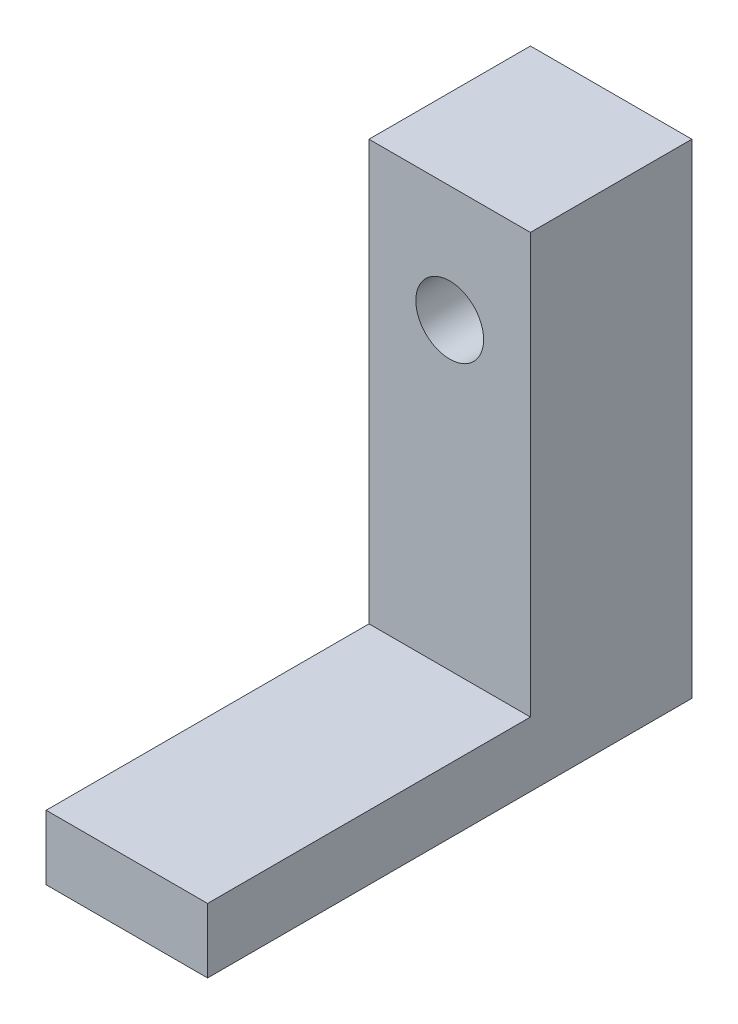
ISO-10303-21;
HEADER;
FILE_DESCRIPTION(('STEP AP214'),'2;1');
FILE_NAME('part.step','',(''),(''),'','','');
FILE_SCHEMA(('AUTOMOTIVE_DESIGN { 1 0 10303 214 1 1 1 1 }'));
ENDSEC;
DATA;
#1=APPLICATION_CONTEXT('core data for automotive mechanical design processes');
#2=APPLICATION_PROTOCOL_DEFINITION('international standard','automotive_design',2000,#1);
#3=PRODUCT_CONTEXT('',#1,'mechanical');
#4=PRODUCT('Part','Part','',(#3));
#5=PRODUCT_RELATED_PRODUCT_CATEGORY('part','',(#4));
#6=PRODUCT_DEFINITION_FORMATION('','',#4);
#7=PRODUCT_DEFINITION_CONTEXT('part definition',#1,'design');
#8=PRODUCT_DEFINITION('design','',#6,#7);
#9=PRODUCT_DEFINITION_SHAPE('','',#8);
#10=(LENGTH_UNIT() NAMED_UNIT(*) SI_UNIT(.MILLI.,.METRE.));
#11=(NAMED_UNIT(*) PLANE_ANGLE_UNIT() SI_UNIT($,.RADIAN.));
#12=(NAMED_UNIT(*) SI_UNIT($,.STERADIAN.) SOLID_ANGLE_UNIT());
#13=UNCERTAINTY_MEASURE_WITH_UNIT(LENGTH_MEASURE(1.E-05),#10,'distance_accuracy_value','');
#14=(GEOMETRIC_REPRESENTATION_CONTEXT(3) GLOBAL_UNCERTAINTY_ASSIGNED_CONTEXT((#13)) GLOBAL_UNIT_ASSIGNED_CONTEXT((#10,
#11,#12)) REPRESENTATION_CONTEXT('',''));
#15=CARTESIAN_POINT('',(0.,0.,0.));
#16=DIRECTION('',(0.,0.,1.));
#17=DIRECTION('',(1.,0.,0.));
#18=AXIS2_PLACEMENT_3D('',#15,#16,#17);
#19=CARTESIAN_POINT('',(0.,0.,5.));
#20=DIRECTION('',(0.,0.,-1.));
#21=DIRECTION('',(-1.,0.,0.));
#22=AXIS2_PLACEMENT_3D('',#19,#20,#21);
#23=PLANE('',#22);
#24=CARTESIAN_POINT('',(2.5,11.4,5.));
#25=DIRECTION('',(0.,0.,1.));
#26=DIRECTION('',(1.,0.,0.));
#27=AXIS2_PLACEMENT_3D('',#24,#25,#26);
#28=CIRCLE('',#27,1.05);
#29=CARTESIAN_POINT('',(3.55,11.4,5.));
#30=VERTEX_POINT('',#29);
#31=EDGE_CURVE('E235',#30,#30,#28,.T.);
#32=ORIENTED_EDGE('',*,*,#31,.F.);
#33=EDGE_LOOP('',(#32));
#34=FACE_BOUND('',#33,.T.);
#35=DIRECTION('',(-1.,0.,0.));
#36=VECTOR('',#35,1.);
#37=CARTESIAN_POINT('',(0.,2.,5.));
#38=LINE('',#37,#36);
#39=CARTESIAN_POINT('',(5.,2.,5.));
#40=VERTEX_POINT('',#39);
#41=CARTESIAN_POINT('',(0.,2.,5.));
#42=VERTEX_POINT('',#41);
#43=EDGE_CURVE('E49',#40,#42,#38,.T.);
#44=ORIENTED_EDGE('',*,*,#43,.F.);
#45=DIRECTION('',(0.,1.,0.));
#46=VECTOR('',#45,1.);
#47=CARTESIAN_POINT('',(5.,0.,5.));
#48=LINE('',#47,#46);
#49=CARTESIAN_POINT('',(5.,15.,5.));
#50=VERTEX_POINT('',#49);
#51=EDGE_CURVE('E138',#40,#50,#48,.T.);
#52=ORIENTED_EDGE('',*,*,#51,.T.);
#53=DIRECTION('',(-1.,0.,0.));
#54=VECTOR('',#53,1.);
#55=CARTESIAN_POINT('',(0.,15.,5.));
#56=LINE('',#55,#54);
#57=CARTESIAN_POINT('',(0.,15.,5.));
#58=VERTEX_POINT('',#57);
#59=EDGE_CURVE('E55',#50,#58,#56,.T.);
#60=ORIENTED_EDGE('',*,*,#59,.T.);
#61=DIRECTION('',(0.,-1.,0.));
#62=VECTOR('',#61,1.);
#63=CARTESIAN_POINT('',(0.,0.,5.));
#64=LINE('',#63,#62);
#65=EDGE_CURVE('E84',#58,#42,#64,.T.);
#66=ORIENTED_EDGE('',*,*,#65,.T.);
#67=EDGE_LOOP('',(#44,#52,#60,#66));
#68=FACE_BOUND('',#67,.T.);
#69=ADVANCED_FACE('F33',(#34,#68),#23,.F.);
#70=CARTESIAN_POINT('',(0.,0.,5.));
#71=DIRECTION('',(1.,0.,0.));
#72=DIRECTION('',(0.,0.,-1.));
#73=AXIS2_PLACEMENT_3D('',#70,#71,#72);
#74=PLANE('',#73);
#75=DIRECTION('',(0.,-1.,0.));
#76=VECTOR('',#75,1.);
#77=CARTESIAN_POINT('',(0.,0.,0.));
#78=LINE('',#77,#76);
#79=CARTESIAN_POINT('',(0.,15.,0.));
#80=VERTEX_POINT('',#79);
#81=CARTESIAN_POINT('',(0.,0.,0.));
#82=VERTEX_POINT('',#81);
#83=EDGE_CURVE('E90',#80,#82,#78,.T.);
#84=ORIENTED_EDGE('',*,*,#83,.T.);
#85=DIRECTION('',(0.,0.,-1.));
#86=VECTOR('',#85,1.);
#87=CARTESIAN_POINT('',(0.,0.,5.));
#88=LINE('',#87,#86);
#89=CARTESIAN_POINT('',(0.,0.,15.));
#90=VERTEX_POINT('',#89);
#91=EDGE_CURVE('E11',#90,#82,#88,.T.);
#92=ORIENTED_EDGE('',*,*,#91,.F.);
#93=DIRECTION('',(0.,-1.,0.));
#94=VECTOR('',#93,1.);
#95=CARTESIAN_POINT('',(0.,0.,15.));
#96=LINE('',#95,#94);
#97=CARTESIAN_POINT('',(0.,2.,15.));
#98=VERTEX_POINT('',#97);
#99=EDGE_CURVE('E128',#98,#90,#96,.T.);
#100=ORIENTED_EDGE('',*,*,#99,.F.);
#101=DIRECTION('',(0.,0.,-1.));
#102=VECTOR('',#101,1.);
#103=CARTESIAN_POINT('',(0.,2.,15.));
#104=LINE('',#103,#102);
#105=EDGE_CURVE('E99',#98,#42,#104,.T.);
#106=ORIENTED_EDGE('',*,*,#105,.T.);
#107=ORIENTED_EDGE('',*,*,#65,.F.);
#108=DIRECTION('',(0.,0.,-1.));
#109=VECTOR('',#108,1.);
#110=CARTESIAN_POINT('',(0.,15.,5.));
#111=LINE('',#110,#109);
#112=EDGE_CURVE('E77',#58,#80,#111,.T.);
#113=ORIENTED_EDGE('',*,*,#112,.T.);
#114=EDGE_LOOP('',(#84,#92,#100,#106,#107,#113));
#115=FACE_BOUND('',#114,.T.);
#116=ADVANCED_FACE('F35',(#115),#74,.F.);
#117=CARTESIAN_POINT('',(0.,0.,5.));
#118=DIRECTION('',(0.,1.,0.));
#119=DIRECTION('',(0.,0.,1.));
#120=AXIS2_PLACEMENT_3D('',#117,#118,#119);
#121=PLANE('',#120);
#122=DIRECTION('',(1.,0.,0.));
#123=VECTOR('',#122,1.);
#124=CARTESIAN_POINT('',(0.,0.,0.));
#125=LINE('',#124,#123);
#126=CARTESIAN_POINT('',(5.,0.,0.));
#127=VERTEX_POINT('',#126);
#128=EDGE_CURVE('E94',#82,#127,#125,.T.);
#129=ORIENTED_EDGE('',*,*,#128,.T.);
#130=DIRECTION('',(0.,0.,-1.));
#131=VECTOR('',#130,1.);
#132=CARTESIAN_POINT('',(5.,0.,5.));
#133=LINE('',#132,#131);
#134=CARTESIAN_POINT('',(5.,0.,15.));
#135=VERTEX_POINT('',#134);
#136=EDGE_CURVE('E42',#135,#127,#133,.T.);
#137=ORIENTED_EDGE('',*,*,#136,.F.);
#138=DIRECTION('',(1.,0.,0.));
#139=VECTOR('',#138,1.);
#140=CARTESIAN_POINT('',(0.,0.,15.));
#141=LINE('',#140,#139);
#142=EDGE_CURVE('E120',#90,#135,#141,.T.);
#143=ORIENTED_EDGE('',*,*,#142,.F.);
#144=ORIENTED_EDGE('',*,*,#91,.T.);
#145=EDGE_LOOP('',(#129,#137,#143,#144));
#146=FACE_BOUND('',#145,.T.);
#147=ADVANCED_FACE('F118',(#146),#121,.F.);
#148=CARTESIAN_POINT('',(5.,0.,5.));
#149=DIRECTION('',(-1.,0.,0.));
#150=DIRECTION('',(0.,0.,1.));
#151=AXIS2_PLACEMENT_3D('',#148,#149,#150);
#152=PLANE('',#151);
#153=DIRECTION('',(0.,1.,0.));
#154=VECTOR('',#153,1.);
#155=CARTESIAN_POINT('',(5.,0.,0.));
#156=LINE('',#155,#154);
#157=CARTESIAN_POINT('',(5.,15.,0.));
#158=VERTEX_POINT('',#157);
#159=EDGE_CURVE('E85',#127,#158,#156,.T.);
#160=ORIENTED_EDGE('',*,*,#159,.T.);
#161=DIRECTION('',(0.,0.,-1.));
#162=VECTOR('',#161,1.);
#163=CARTESIAN_POINT('',(5.,15.,5.));
#164=LINE('',#163,#162);
#165=EDGE_CURVE('E80',#50,#158,#164,.T.);
#166=ORIENTED_EDGE('',*,*,#165,.F.);
#167=ORIENTED_EDGE('',*,*,#51,.F.);
#168=DIRECTION('',(0.,0.,-1.));
#169=VECTOR('',#168,1.);
#170=CARTESIAN_POINT('',(5.,2.,15.));
#171=LINE('',#170,#169);
#172=CARTESIAN_POINT('',(5.,2.,15.));
#173=VERTEX_POINT('',#172);
#174=EDGE_CURVE('E95',#173,#40,#171,.T.);
#175=ORIENTED_EDGE('',*,*,#174,.F.);
#176=DIRECTION('',(0.,1.,0.));
#177=VECTOR('',#176,1.);
#178=CARTESIAN_POINT('',(5.,0.,15.));
#179=LINE('',#178,#177);
#180=EDGE_CURVE('E114',#135,#173,#179,.T.);
#181=ORIENTED_EDGE('',*,*,#180,.F.);
#182=ORIENTED_EDGE('',*,*,#136,.T.);
#183=EDGE_LOOP('',(#160,#166,#167,#175,#181,#182));
#184=FACE_BOUND('',#183,.T.);
#185=ADVANCED_FACE('F110',(#184),#152,.F.);
#186=CARTESIAN_POINT('',(0.,15.,5.));
#187=DIRECTION('',(0.,-1.,0.));
#188=DIRECTION('',(0.,0.,-1.));
#189=AXIS2_PLACEMENT_3D('',#186,#187,#188);
#190=PLANE('',#189);
#191=DIRECTION('',(-1.,0.,0.));
#192=VECTOR('',#191,1.);
#193=CARTESIAN_POINT('',(0.,15.,0.));
#194=LINE('',#193,#192);
#195=EDGE_CURVE('E74',#158,#80,#194,.T.);
#196=ORIENTED_EDGE('',*,*,#195,.T.);
#197=ORIENTED_EDGE('',*,*,#112,.F.);
#198=ORIENTED_EDGE('',*,*,#59,.F.);
#199=ORIENTED_EDGE('',*,*,#165,.T.);
#200=EDGE_LOOP('',(#196,#197,#198,#199));
#201=FACE_BOUND('',#200,.T.);
#202=ADVANCED_FACE('F76',(#201),#190,.F.);
#203=CARTESIAN_POINT('',(0.,0.,0.));
#204=DIRECTION('',(0.,0.,-1.));
#205=DIRECTION('',(-1.,0.,0.));
#206=AXIS2_PLACEMENT_3D('',#203,#204,#205);
#207=PLANE('',#206);
#208=CARTESIAN_POINT('',(2.5,11.4,0.));
#209=DIRECTION('',(0.,0.,-1.));
#210=DIRECTION('',(-1.,0.,0.));
#211=AXIS2_PLACEMENT_3D('',#208,#209,#210);
#212=CIRCLE('',#211,1.05);
#213=CARTESIAN_POINT('',(1.45,11.4,0.));
#214=VERTEX_POINT('',#213);
#215=EDGE_CURVE('E37',#214,#214,#212,.T.);
#216=ORIENTED_EDGE('',*,*,#215,.F.);
#217=EDGE_LOOP('',(#216));
#218=FACE_BOUND('',#217,.T.);
#219=ORIENTED_EDGE('',*,*,#83,.F.);
#220=ORIENTED_EDGE('',*,*,#195,.F.);
#221=ORIENTED_EDGE('',*,*,#159,.F.);
#222=ORIENTED_EDGE('',*,*,#128,.F.);
#223=EDGE_LOOP('',(#219,#220,#221,#222));
#224=FACE_BOUND('',#223,.T.);
#225=ADVANCED_FACE('F93',(#218,#224),#207,.T.);
#226=CARTESIAN_POINT('',(0.,2.,15.));
#227=DIRECTION('',(0.,-1.,0.));
#228=DIRECTION('',(0.,0.,-1.));
#229=AXIS2_PLACEMENT_3D('',#226,#227,#228);
#230=PLANE('',#229);
#231=ORIENTED_EDGE('',*,*,#43,.T.);
#232=ORIENTED_EDGE('',*,*,#105,.F.);
#233=DIRECTION('',(-1.,0.,0.));
#234=VECTOR('',#233,1.);
#235=CARTESIAN_POINT('',(0.,2.,15.));
#236=LINE('',#235,#234);
#237=EDGE_CURVE('E130',#173,#98,#236,.T.);
#238=ORIENTED_EDGE('',*,*,#237,.F.);
#239=ORIENTED_EDGE('',*,*,#174,.T.);
#240=EDGE_LOOP('',(#231,#232,#238,#239));
#241=FACE_BOUND('',#240,.T.);
#242=ADVANCED_FACE('F141',(#241),#230,.F.);
#243=CARTESIAN_POINT('',(0.,0.,15.));
#244=DIRECTION('',(0.,0.,-1.));
#245=DIRECTION('',(-1.,0.,0.));
#246=AXIS2_PLACEMENT_3D('',#243,#244,#245);
#247=PLANE('',#246);
#248=ORIENTED_EDGE('',*,*,#99,.T.);
#249=ORIENTED_EDGE('',*,*,#142,.T.);
#250=ORIENTED_EDGE('',*,*,#180,.T.);
#251=ORIENTED_EDGE('',*,*,#237,.T.);
#252=EDGE_LOOP('',(#248,#249,#250,#251));
#253=FACE_BOUND('',#252,.T.);
#254=ADVANCED_FACE('F125',(#253),#247,.F.);
#255=CARTESIAN_POINT('',(2.5,11.4,-5.));
#256=DIRECTION('',(0.,0.,1.));
#257=DIRECTION('',(1.,0.,0.));
#258=AXIS2_PLACEMENT_3D('',#255,#256,#257);
#259=CYLINDRICAL_SURFACE('',#258,1.05);
#260=ORIENTED_EDGE('',*,*,#215,.T.);
#261=EDGE_LOOP('',(#260));
#262=FACE_BOUND('',#261,.T.);
#263=ORIENTED_EDGE('',*,*,#31,.T.);
#264=EDGE_LOOP('',(#263));
#265=FACE_BOUND('',#264,.T.);
#266=ADVANCED_FACE('F153',(#262,#265),#259,.F.);
#267=CLOSED_SHELL('',(#69,#116,#147,#185,#202,#225,#242,#254,#266));
#268=MANIFOLD_SOLID_BREP('B2',#267);
#269=ADVANCED_BREP_SHAPE_REPRESENTATION('',(#18,#268),#14);
#270=SHAPE_DEFINITION_REPRESENTATION(#9,#269);
ENDSEC;
END-ISO-10303-21;
